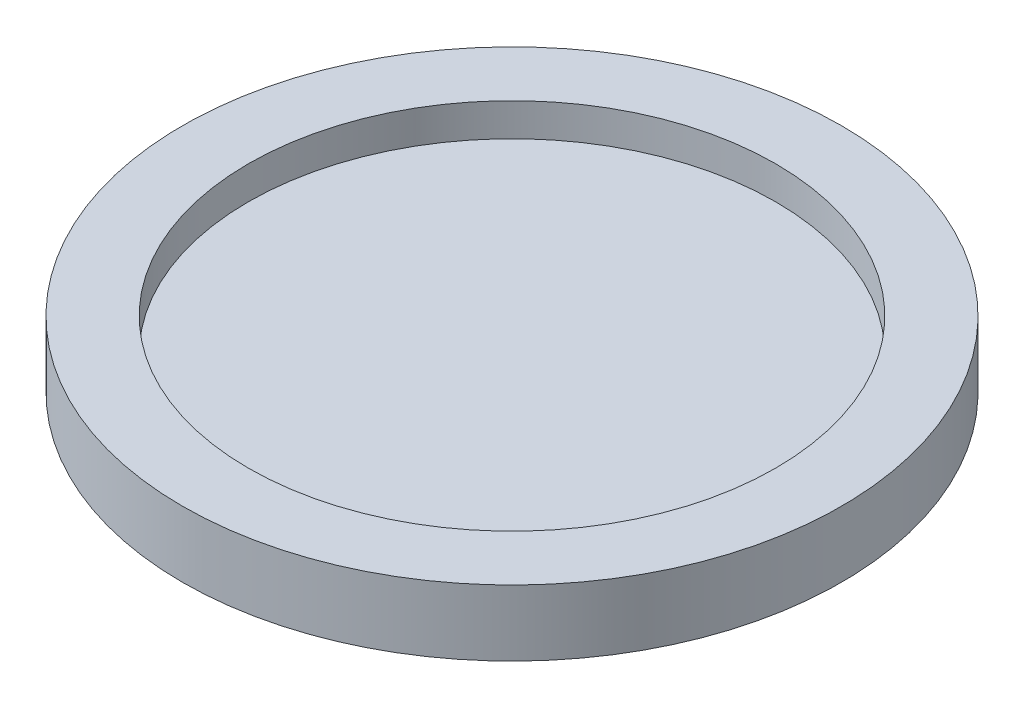
ISO-10303-21;
HEADER;
FILE_DESCRIPTION(('STEP AP214'),'2;1');
FILE_NAME('part.step','',(''),(''),'','','');
FILE_SCHEMA(('AUTOMOTIVE_DESIGN { 1 0 10303 214 1 1 1 1 }'));
ENDSEC;
DATA;
#1=APPLICATION_CONTEXT('core data for automotive mechanical design processes');
#2=APPLICATION_PROTOCOL_DEFINITION('international standard','automotive_design',2000,#1);
#3=PRODUCT_CONTEXT('',#1,'mechanical');
#4=PRODUCT('Part','Part','',(#3));
#5=PRODUCT_RELATED_PRODUCT_CATEGORY('part','',(#4));
#6=PRODUCT_DEFINITION_FORMATION('','',#4);
#7=PRODUCT_DEFINITION_CONTEXT('part definition',#1,'design');
#8=PRODUCT_DEFINITION('design','',#6,#7);
#9=PRODUCT_DEFINITION_SHAPE('','',#8);
#10=(LENGTH_UNIT() NAMED_UNIT(*) SI_UNIT(.MILLI.,.METRE.));
#11=(NAMED_UNIT(*) PLANE_ANGLE_UNIT() SI_UNIT($,.RADIAN.));
#12=(NAMED_UNIT(*) SI_UNIT($,.STERADIAN.) SOLID_ANGLE_UNIT());
#13=UNCERTAINTY_MEASURE_WITH_UNIT(LENGTH_MEASURE(1.E-05),#10,'distance_accuracy_value','');
#14=(GEOMETRIC_REPRESENTATION_CONTEXT(3) GLOBAL_UNCERTAINTY_ASSIGNED_CONTEXT((#13)) GLOBAL_UNIT_ASSIGNED_CONTEXT((#10,
#11,#12)) REPRESENTATION_CONTEXT('',''));
#15=CARTESIAN_POINT('',(0.,0.,0.));
#16=DIRECTION('',(0.,0.,1.));
#17=DIRECTION('',(1.,0.,0.));
#18=AXIS2_PLACEMENT_3D('',#15,#16,#17);
#19=CARTESIAN_POINT('',(0.,1.,0.));
#20=DIRECTION('',(0.,1.,0.));
#21=DIRECTION('',(0.,0.,1.));
#22=AXIS2_PLACEMENT_3D('',#19,#20,#21);
#23=PLANE('',#22);
#24=CARTESIAN_POINT('',(0.,1.,0.));
#25=DIRECTION('',(0.,1.,0.));
#26=DIRECTION('',(0.,0.,1.));
#27=AXIS2_PLACEMENT_3D('',#24,#25,#26);
#28=CIRCLE('',#27,5.);
#29=CARTESIAN_POINT('',(0.,1.,5.));
#30=VERTEX_POINT('',#29);
#31=EDGE_CURVE('E51',#30,#30,#28,.T.);
#32=ORIENTED_EDGE('',*,*,#31,.T.);
#33=EDGE_LOOP('',(#32));
#34=FACE_BOUND('',#33,.T.);
#35=CARTESIAN_POINT('',(0.,1.,0.));
#36=DIRECTION('',(0.,1.,0.));
#37=DIRECTION('',(0.,0.,1.));
#38=AXIS2_PLACEMENT_3D('',#35,#36,#37);
#39=CIRCLE('',#38,4.);
#40=CARTESIAN_POINT('',(0.,1.,4.));
#41=VERTEX_POINT('',#40);
#42=EDGE_CURVE('E62',#41,#41,#39,.T.);
#43=ORIENTED_EDGE('',*,*,#42,.F.);
#44=EDGE_LOOP('',(#43));
#45=FACE_BOUND('',#44,.T.);
#46=ADVANCED_FACE('F43',(#34,#45),#23,.T.);
#47=CARTESIAN_POINT('',(0.,0.,0.));
#48=DIRECTION('',(0.,1.,0.));
#49=DIRECTION('',(0.,0.,1.));
#50=AXIS2_PLACEMENT_3D('',#47,#48,#49);
#51=PLANE('',#50);
#52=CARTESIAN_POINT('',(0.,0.,0.));
#53=DIRECTION('',(0.,1.,0.));
#54=DIRECTION('',(0.,0.,1.));
#55=AXIS2_PLACEMENT_3D('',#52,#53,#54);
#56=CIRCLE('',#55,5.);
#57=CARTESIAN_POINT('',(0.,0.,5.));
#58=VERTEX_POINT('',#57);
#59=EDGE_CURVE('E56',#58,#58,#56,.T.);
#60=ORIENTED_EDGE('',*,*,#59,.F.);
#61=EDGE_LOOP('',(#60));
#62=FACE_BOUND('',#61,.T.);
#63=ADVANCED_FACE('F71',(#62),#51,.F.);
#64=CARTESIAN_POINT('',(0.,1.,0.));
#65=DIRECTION('',(0.,-1.,0.));
#66=DIRECTION('',(0.,0.,-1.));
#67=AXIS2_PLACEMENT_3D('',#64,#65,#66);
#68=CYLINDRICAL_SURFACE('',#67,5.);
#69=ORIENTED_EDGE('',*,*,#31,.F.);
#70=EDGE_LOOP('',(#69));
#71=FACE_BOUND('',#70,.T.);
#72=ORIENTED_EDGE('',*,*,#59,.T.);
#73=EDGE_LOOP('',(#72));
#74=FACE_BOUND('',#73,.T.);
#75=ADVANCED_FACE('F45',(#71,#74),#68,.T.);
#76=CARTESIAN_POINT('',(0.,1.,0.));
#77=DIRECTION('',(0.,-1.,0.));
#78=DIRECTION('',(0.,0.,-1.));
#79=AXIS2_PLACEMENT_3D('',#76,#77,#78);
#80=CYLINDRICAL_SURFACE('',#79,4.);
#81=CARTESIAN_POINT('',(0.,0.5,0.));
#82=DIRECTION('',(0.,1.,0.));
#83=DIRECTION('',(0.,0.,1.));
#84=AXIS2_PLACEMENT_3D('',#81,#82,#83);
#85=CIRCLE('',#84,4.);
#86=CARTESIAN_POINT('',(0.,0.5,4.));
#87=VERTEX_POINT('',#86);
#88=EDGE_CURVE('E10',#87,#87,#85,.T.);
#89=ORIENTED_EDGE('',*,*,#88,.F.);
#90=EDGE_LOOP('',(#89));
#91=FACE_BOUND('',#90,.T.);
#92=ORIENTED_EDGE('',*,*,#42,.T.);
#93=EDGE_LOOP('',(#92));
#94=FACE_BOUND('',#93,.T.);
#95=ADVANCED_FACE('F68',(#91,#94),#80,.F.);
#96=CARTESIAN_POINT('',(0.,0.5,0.));
#97=DIRECTION('',(0.,1.,0.));
#98=DIRECTION('',(0.,0.,1.));
#99=AXIS2_PLACEMENT_3D('',#96,#97,#98);
#100=PLANE('',#99);
#101=ORIENTED_EDGE('',*,*,#88,.T.);
#102=EDGE_LOOP('',(#101));
#103=FACE_BOUND('',#102,.T.);
#104=ADVANCED_FACE('F80',(#103),#100,.T.);
#105=CLOSED_SHELL('',(#46,#63,#75,#95,#104));
#106=MANIFOLD_SOLID_BREP('B2',#105);
#107=ADVANCED_BREP_SHAPE_REPRESENTATION('',(#18,#106),#14);
#108=SHAPE_DEFINITION_REPRESENTATION(#9,#107);
ENDSEC;
END-ISO-10303-21;
